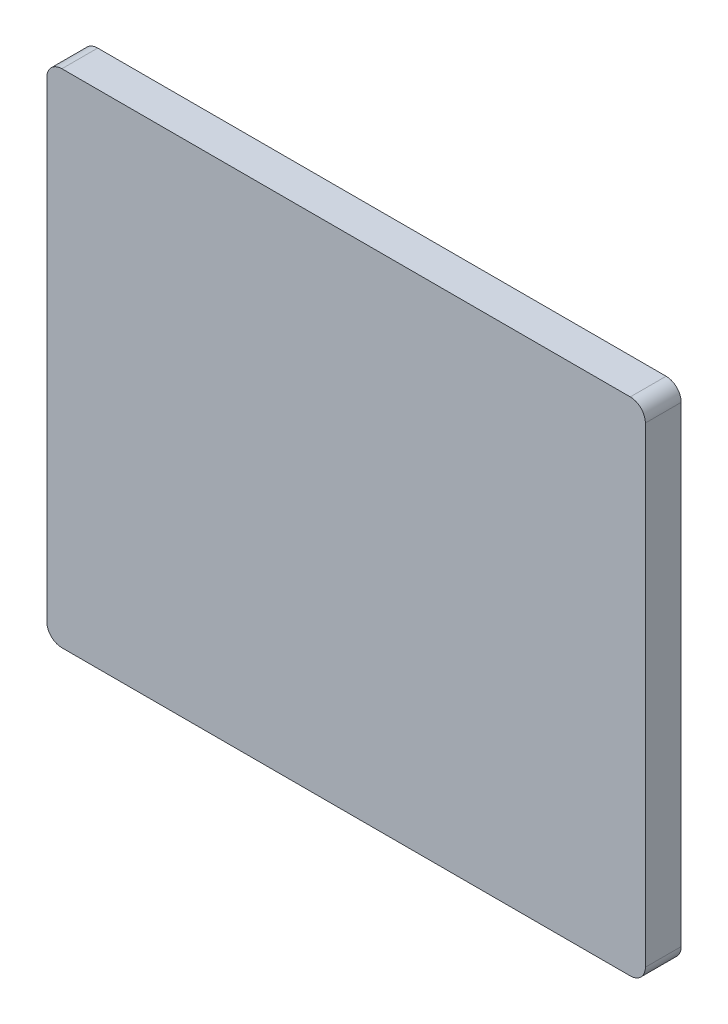
ISO-10303-21;
HEADER;
FILE_DESCRIPTION(('STEP AP214'),'2;1');
FILE_NAME('part.step','',(''),(''),'','','');
FILE_SCHEMA(('AUTOMOTIVE_DESIGN { 1 0 10303 214 1 1 1 1 }'));
ENDSEC;
DATA;
#1=APPLICATION_CONTEXT('core data for automotive mechanical design processes');
#2=APPLICATION_PROTOCOL_DEFINITION('international standard','automotive_design',2000,#1);
#3=PRODUCT_CONTEXT('',#1,'mechanical');
#4=PRODUCT('Part','Part','',(#3));
#5=PRODUCT_RELATED_PRODUCT_CATEGORY('part','',(#4));
#6=PRODUCT_DEFINITION_FORMATION('','',#4);
#7=PRODUCT_DEFINITION_CONTEXT('part definition',#1,'design');
#8=PRODUCT_DEFINITION('design','',#6,#7);
#9=PRODUCT_DEFINITION_SHAPE('','',#8);
#10=(LENGTH_UNIT() NAMED_UNIT(*) SI_UNIT(.MILLI.,.METRE.));
#11=(NAMED_UNIT(*) PLANE_ANGLE_UNIT() SI_UNIT($,.RADIAN.));
#12=(NAMED_UNIT(*) SI_UNIT($,.STERADIAN.) SOLID_ANGLE_UNIT());
#13=UNCERTAINTY_MEASURE_WITH_UNIT(LENGTH_MEASURE(1.E-05),#10,'distance_accuracy_value','');
#14=(GEOMETRIC_REPRESENTATION_CONTEXT(3) GLOBAL_UNCERTAINTY_ASSIGNED_CONTEXT((#13)) GLOBAL_UNIT_ASSIGNED_CONTEXT((#10,
#11,#12)) REPRESENTATION_CONTEXT('',''));
#15=CARTESIAN_POINT('',(0.,0.,0.));
#16=DIRECTION('',(0.,0.,1.));
#17=DIRECTION('',(1.,0.,0.));
#18=AXIS2_PLACEMENT_3D('',#15,#16,#17);
#19=CARTESIAN_POINT('',(-15.875,-13.3,1.9));
#20=DIRECTION('',(1.,0.,0.));
#21=DIRECTION('',(0.,0.,-1.));
#22=AXIS2_PLACEMENT_3D('',#19,#20,#21);
#23=PLANE('',#22);
#24=DIRECTION('',(0.,-1.,0.));
#25=VECTOR('',#24,1.);
#26=CARTESIAN_POINT('',(-15.875,-13.3,1.9));
#27=LINE('',#26,#25);
#28=CARTESIAN_POINT('',(-15.875,12.5,1.9));
#29=VERTEX_POINT('',#28);
#30=CARTESIAN_POINT('',(-15.875,-12.5,1.9));
#31=VERTEX_POINT('',#30);
#32=EDGE_CURVE('E118',#29,#31,#27,.T.);
#33=ORIENTED_EDGE('',*,*,#32,.F.);
#34=DIRECTION('',(0.,0.,-1.));
#35=VECTOR('',#34,1.);
#36=CARTESIAN_POINT('',(-15.875,12.5,1.9));
#37=LINE('',#36,#35);
#38=CARTESIAN_POINT('',(-15.875,12.5,0.));
#39=VERTEX_POINT('',#38);
#40=EDGE_CURVE('E103',#29,#39,#37,.T.);
#41=ORIENTED_EDGE('',*,*,#40,.T.);
#42=DIRECTION('',(0.,-1.,0.));
#43=VECTOR('',#42,1.);
#44=CARTESIAN_POINT('',(-15.875,-13.3,0.));
#45=LINE('',#44,#43);
#46=CARTESIAN_POINT('',(-15.875,-12.5,0.));
#47=VERTEX_POINT('',#46);
#48=EDGE_CURVE('E115',#39,#47,#45,.T.);
#49=ORIENTED_EDGE('',*,*,#48,.T.);
#50=DIRECTION('',(0.,0.,-1.));
#51=VECTOR('',#50,1.);
#52=CARTESIAN_POINT('',(-15.875,-12.5,1.9));
#53=LINE('',#52,#51);
#54=EDGE_CURVE('E120',#47,#31,#53,.F.);
#55=ORIENTED_EDGE('',*,*,#54,.T.);
#56=EDGE_LOOP('',(#33,#41,#49,#55));
#57=FACE_BOUND('',#56,.T.);
#58=ADVANCED_FACE('F33',(#57),#23,.F.);
#59=CARTESIAN_POINT('',(15.875,-13.3,1.9));
#60=DIRECTION('',(0.,1.,0.));
#61=DIRECTION('',(-1.,0.,0.));
#62=AXIS2_PLACEMENT_3D('',#59,#60,#61);
#63=PLANE('',#62);
#64=DIRECTION('',(1.,0.,0.));
#65=VECTOR('',#64,1.);
#66=CARTESIAN_POINT('',(15.875,-13.3,0.));
#67=LINE('',#66,#65);
#68=CARTESIAN_POINT('',(-15.075,-13.3,0.));
#69=VERTEX_POINT('',#68);
#70=CARTESIAN_POINT('',(15.075,-13.3,0.));
#71=VERTEX_POINT('',#70);
#72=EDGE_CURVE('E124',#69,#71,#67,.T.);
#73=ORIENTED_EDGE('',*,*,#72,.T.);
#74=DIRECTION('',(0.,0.,-1.));
#75=VECTOR('',#74,1.);
#76=CARTESIAN_POINT('',(15.075,-13.3,1.9));
#77=LINE('',#76,#75);
#78=CARTESIAN_POINT('',(15.075,-13.3,1.9));
#79=VERTEX_POINT('',#78);
#80=EDGE_CURVE('E11',#71,#79,#77,.F.);
#81=ORIENTED_EDGE('',*,*,#80,.T.);
#82=DIRECTION('',(1.,0.,0.));
#83=VECTOR('',#82,1.);
#84=CARTESIAN_POINT('',(15.875,-13.3,1.9));
#85=LINE('',#84,#83);
#86=CARTESIAN_POINT('',(-15.075,-13.3,1.9));
#87=VERTEX_POINT('',#86);
#88=EDGE_CURVE('E160',#87,#79,#85,.T.);
#89=ORIENTED_EDGE('',*,*,#88,.F.);
#90=DIRECTION('',(0.,0.,-1.));
#91=VECTOR('',#90,1.);
#92=CARTESIAN_POINT('',(-15.075,-13.3,1.9));
#93=LINE('',#92,#91);
#94=EDGE_CURVE('E41',#87,#69,#93,.T.);
#95=ORIENTED_EDGE('',*,*,#94,.T.);
#96=EDGE_LOOP('',(#73,#81,#89,#95));
#97=FACE_BOUND('',#96,.T.);
#98=ADVANCED_FACE('F158',(#97),#63,.F.);
#99=CARTESIAN_POINT('',(15.875,-13.3,1.9));
#100=DIRECTION('',(-1.,0.,0.));
#101=DIRECTION('',(0.,0.,1.));
#102=AXIS2_PLACEMENT_3D('',#99,#100,#101);
#103=PLANE('',#102);
#104=DIRECTION('',(0.,1.,0.));
#105=VECTOR('',#104,1.);
#106=CARTESIAN_POINT('',(15.875,-13.3,0.));
#107=LINE('',#106,#105);
#108=CARTESIAN_POINT('',(15.875,-12.5,0.));
#109=VERTEX_POINT('',#108);
#110=CARTESIAN_POINT('',(15.875,12.5,0.));
#111=VERTEX_POINT('',#110);
#112=EDGE_CURVE('E127',#109,#111,#107,.T.);
#113=ORIENTED_EDGE('',*,*,#112,.T.);
#114=DIRECTION('',(0.,0.,-1.));
#115=VECTOR('',#114,1.);
#116=CARTESIAN_POINT('',(15.875,12.5,1.9));
#117=LINE('',#116,#115);
#118=CARTESIAN_POINT('',(15.875,12.5,1.9));
#119=VERTEX_POINT('',#118);
#120=EDGE_CURVE('E48',#111,#119,#117,.F.);
#121=ORIENTED_EDGE('',*,*,#120,.T.);
#122=DIRECTION('',(0.,1.,0.));
#123=VECTOR('',#122,1.);
#124=CARTESIAN_POINT('',(15.875,-13.3,1.9));
#125=LINE('',#124,#123);
#126=CARTESIAN_POINT('',(15.875,-12.5,1.9));
#127=VERTEX_POINT('',#126);
#128=EDGE_CURVE('E168',#127,#119,#125,.T.);
#129=ORIENTED_EDGE('',*,*,#128,.F.);
#130=DIRECTION('',(0.,0.,-1.));
#131=VECTOR('',#130,1.);
#132=CARTESIAN_POINT('',(15.875,-12.5,1.9));
#133=LINE('',#132,#131);
#134=EDGE_CURVE('E151',#127,#109,#133,.T.);
#135=ORIENTED_EDGE('',*,*,#134,.T.);
#136=EDGE_LOOP('',(#113,#121,#129,#135));
#137=FACE_BOUND('',#136,.T.);
#138=ADVANCED_FACE('F167',(#137),#103,.F.);
#139=CARTESIAN_POINT('',(15.875,13.3,1.9));
#140=DIRECTION('',(0.,-1.,0.));
#141=DIRECTION('',(1.,0.,0.));
#142=AXIS2_PLACEMENT_3D('',#139,#140,#141);
#143=PLANE('',#142);
#144=DIRECTION('',(-1.,0.,0.));
#145=VECTOR('',#144,1.);
#146=CARTESIAN_POINT('',(15.875,13.3,0.));
#147=LINE('',#146,#145);
#148=CARTESIAN_POINT('',(15.075,13.3,0.));
#149=VERTEX_POINT('',#148);
#150=CARTESIAN_POINT('',(-15.075,13.3,0.));
#151=VERTEX_POINT('',#150);
#152=EDGE_CURVE('E134',#149,#151,#147,.T.);
#153=ORIENTED_EDGE('',*,*,#152,.T.);
#154=DIRECTION('',(0.,0.,-1.));
#155=VECTOR('',#154,1.);
#156=CARTESIAN_POINT('',(-15.075,13.3,1.9));
#157=LINE('',#156,#155);
#158=CARTESIAN_POINT('',(-15.075,13.3,1.9));
#159=VERTEX_POINT('',#158);
#160=EDGE_CURVE('E104',#151,#159,#157,.F.);
#161=ORIENTED_EDGE('',*,*,#160,.T.);
#162=DIRECTION('',(-1.,0.,0.));
#163=VECTOR('',#162,1.);
#164=CARTESIAN_POINT('',(15.875,13.3,1.9));
#165=LINE('',#164,#163);
#166=CARTESIAN_POINT('',(15.075,13.3,1.9));
#167=VERTEX_POINT('',#166);
#168=EDGE_CURVE('E130',#167,#159,#165,.T.);
#169=ORIENTED_EDGE('',*,*,#168,.F.);
#170=DIRECTION('',(0.,0.,-1.));
#171=VECTOR('',#170,1.);
#172=CARTESIAN_POINT('',(15.075,13.3,1.9));
#173=LINE('',#172,#171);
#174=EDGE_CURVE('E109',#167,#149,#173,.T.);
#175=ORIENTED_EDGE('',*,*,#174,.T.);
#176=EDGE_LOOP('',(#153,#161,#169,#175));
#177=FACE_BOUND('',#176,.T.);
#178=ADVANCED_FACE('F196',(#177),#143,.F.);
#179=CARTESIAN_POINT('',(0.,0.,1.9));
#180=DIRECTION('',(0.,0.,1.));
#181=DIRECTION('',(1.,0.,0.));
#182=AXIS2_PLACEMENT_3D('',#179,#180,#181);
#183=PLANE('',#182);
#184=ORIENTED_EDGE('',*,*,#168,.T.);
#185=CARTESIAN_POINT('',(-15.075,12.5,1.9));
#186=DIRECTION('',(0.,0.,1.));
#187=DIRECTION('',(1.,0.,0.));
#188=AXIS2_PLACEMENT_3D('',#185,#186,#187);
#189=CIRCLE('',#188,0.8);
#190=EDGE_CURVE('E149',#159,#29,#189,.T.);
#191=ORIENTED_EDGE('',*,*,#190,.T.);
#192=ORIENTED_EDGE('',*,*,#32,.T.);
#193=CARTESIAN_POINT('',(-15.075,-12.5,1.9));
#194=DIRECTION('',(0.,0.,1.));
#195=DIRECTION('',(1.,0.,0.));
#196=AXIS2_PLACEMENT_3D('',#193,#194,#195);
#197=CIRCLE('',#196,0.8);
#198=EDGE_CURVE('E144',#31,#87,#197,.T.);
#199=ORIENTED_EDGE('',*,*,#198,.T.);
#200=ORIENTED_EDGE('',*,*,#88,.T.);
#201=CARTESIAN_POINT('',(15.075,-12.5,1.9));
#202=DIRECTION('',(0.,0.,1.));
#203=DIRECTION('',(1.,0.,0.));
#204=AXIS2_PLACEMENT_3D('',#201,#202,#203);
#205=CIRCLE('',#204,0.8);
#206=EDGE_CURVE('E55',#79,#127,#205,.T.);
#207=ORIENTED_EDGE('',*,*,#206,.T.);
#208=ORIENTED_EDGE('',*,*,#128,.T.);
#209=CARTESIAN_POINT('',(15.075,12.5,1.9));
#210=DIRECTION('',(0.,0.,1.));
#211=DIRECTION('',(1.,0.,0.));
#212=AXIS2_PLACEMENT_3D('',#209,#210,#211);
#213=CIRCLE('',#212,0.8);
#214=EDGE_CURVE('E147',#119,#167,#213,.T.);
#215=ORIENTED_EDGE('',*,*,#214,.T.);
#216=EDGE_LOOP('',(#184,#191,#192,#199,#200,#207,#208,#215));
#217=FACE_BOUND('',#216,.T.);
#218=ADVANCED_FACE('F173',(#217),#183,.T.);
#219=CARTESIAN_POINT('',(0.,0.,0.));
#220=DIRECTION('',(0.,0.,1.));
#221=DIRECTION('',(1.,0.,0.));
#222=AXIS2_PLACEMENT_3D('',#219,#220,#221);
#223=PLANE('',#222);
#224=ORIENTED_EDGE('',*,*,#48,.F.);
#225=CARTESIAN_POINT('',(-15.075,12.5,0.));
#226=DIRECTION('',(0.,0.,1.));
#227=DIRECTION('',(1.,0.,0.));
#228=AXIS2_PLACEMENT_3D('',#225,#226,#227);
#229=CIRCLE('',#228,0.8);
#230=EDGE_CURVE('E99',#39,#151,#229,.F.);
#231=ORIENTED_EDGE('',*,*,#230,.T.);
#232=ORIENTED_EDGE('',*,*,#152,.F.);
#233=CARTESIAN_POINT('',(15.075,12.5,0.));
#234=DIRECTION('',(0.,0.,1.));
#235=DIRECTION('',(1.,0.,0.));
#236=AXIS2_PLACEMENT_3D('',#233,#234,#235);
#237=CIRCLE('',#236,0.8);
#238=EDGE_CURVE('E110',#149,#111,#237,.F.);
#239=ORIENTED_EDGE('',*,*,#238,.T.);
#240=ORIENTED_EDGE('',*,*,#112,.F.);
#241=CARTESIAN_POINT('',(15.075,-12.5,0.));
#242=DIRECTION('',(0.,0.,1.));
#243=DIRECTION('',(1.,0.,0.));
#244=AXIS2_PLACEMENT_3D('',#241,#242,#243);
#245=CIRCLE('',#244,0.8);
#246=EDGE_CURVE('E138',#109,#71,#245,.F.);
#247=ORIENTED_EDGE('',*,*,#246,.T.);
#248=ORIENTED_EDGE('',*,*,#72,.F.);
#249=CARTESIAN_POINT('',(-15.075,-12.5,0.));
#250=DIRECTION('',(0.,0.,1.));
#251=DIRECTION('',(1.,0.,0.));
#252=AXIS2_PLACEMENT_3D('',#249,#250,#251);
#253=CIRCLE('',#252,0.8);
#254=EDGE_CURVE('E119',#69,#47,#253,.F.);
#255=ORIENTED_EDGE('',*,*,#254,.T.);
#256=EDGE_LOOP('',(#224,#231,#232,#239,#240,#247,#248,#255));
#257=FACE_BOUND('',#256,.T.);
#258=ADVANCED_FACE('F122',(#257),#223,.F.);
#259=CARTESIAN_POINT('',(-15.075,12.5,1.9));
#260=DIRECTION('',(0.,0.,-1.));
#261=DIRECTION('',(-1.,0.,0.));
#262=AXIS2_PLACEMENT_3D('',#259,#260,#261);
#263=CYLINDRICAL_SURFACE('',#262,0.8);
#264=ORIENTED_EDGE('',*,*,#190,.F.);
#265=ORIENTED_EDGE('',*,*,#160,.F.);
#266=ORIENTED_EDGE('',*,*,#230,.F.);
#267=ORIENTED_EDGE('',*,*,#40,.F.);
#268=EDGE_LOOP('',(#264,#265,#266,#267));
#269=FACE_BOUND('',#268,.T.);
#270=ADVANCED_FACE('F102',(#269),#263,.T.);
#271=CARTESIAN_POINT('',(15.075,12.5,1.9));
#272=DIRECTION('',(0.,0.,-1.));
#273=DIRECTION('',(-1.,0.,0.));
#274=AXIS2_PLACEMENT_3D('',#271,#272,#273);
#275=CYLINDRICAL_SURFACE('',#274,0.8);
#276=ORIENTED_EDGE('',*,*,#214,.F.);
#277=ORIENTED_EDGE('',*,*,#120,.F.);
#278=ORIENTED_EDGE('',*,*,#238,.F.);
#279=ORIENTED_EDGE('',*,*,#174,.F.);
#280=EDGE_LOOP('',(#276,#277,#278,#279));
#281=FACE_BOUND('',#280,.T.);
#282=ADVANCED_FACE('F178',(#281),#275,.T.);
#283=CARTESIAN_POINT('',(15.075,-12.5,1.9));
#284=DIRECTION('',(0.,0.,-1.));
#285=DIRECTION('',(-1.,0.,0.));
#286=AXIS2_PLACEMENT_3D('',#283,#284,#285);
#287=CYLINDRICAL_SURFACE('',#286,0.8);
#288=ORIENTED_EDGE('',*,*,#206,.F.);
#289=ORIENTED_EDGE('',*,*,#80,.F.);
#290=ORIENTED_EDGE('',*,*,#246,.F.);
#291=ORIENTED_EDGE('',*,*,#134,.F.);
#292=EDGE_LOOP('',(#288,#289,#290,#291));
#293=FACE_BOUND('',#292,.T.);
#294=ADVANCED_FACE('F166',(#293),#287,.T.);
#295=CARTESIAN_POINT('',(-15.075,-12.5,1.9));
#296=DIRECTION('',(0.,0.,-1.));
#297=DIRECTION('',(-1.,0.,0.));
#298=AXIS2_PLACEMENT_3D('',#295,#296,#297);
#299=CYLINDRICAL_SURFACE('',#298,0.8);
#300=ORIENTED_EDGE('',*,*,#198,.F.);
#301=ORIENTED_EDGE('',*,*,#54,.F.);
#302=ORIENTED_EDGE('',*,*,#254,.F.);
#303=ORIENTED_EDGE('',*,*,#94,.F.);
#304=EDGE_LOOP('',(#300,#301,#302,#303));
#305=FACE_BOUND('',#304,.T.);
#306=ADVANCED_FACE('F35',(#305),#299,.T.);
#307=CLOSED_SHELL('',(#58,#98,#138,#178,#218,#258,#270,#282,#294,#306));
#308=MANIFOLD_SOLID_BREP('B2',#307);
#309=ADVANCED_BREP_SHAPE_REPRESENTATION('',(#18,#308),#14);
#310=SHAPE_DEFINITION_REPRESENTATION(#9,#309);
ENDSEC;
END-ISO-10303-21;
